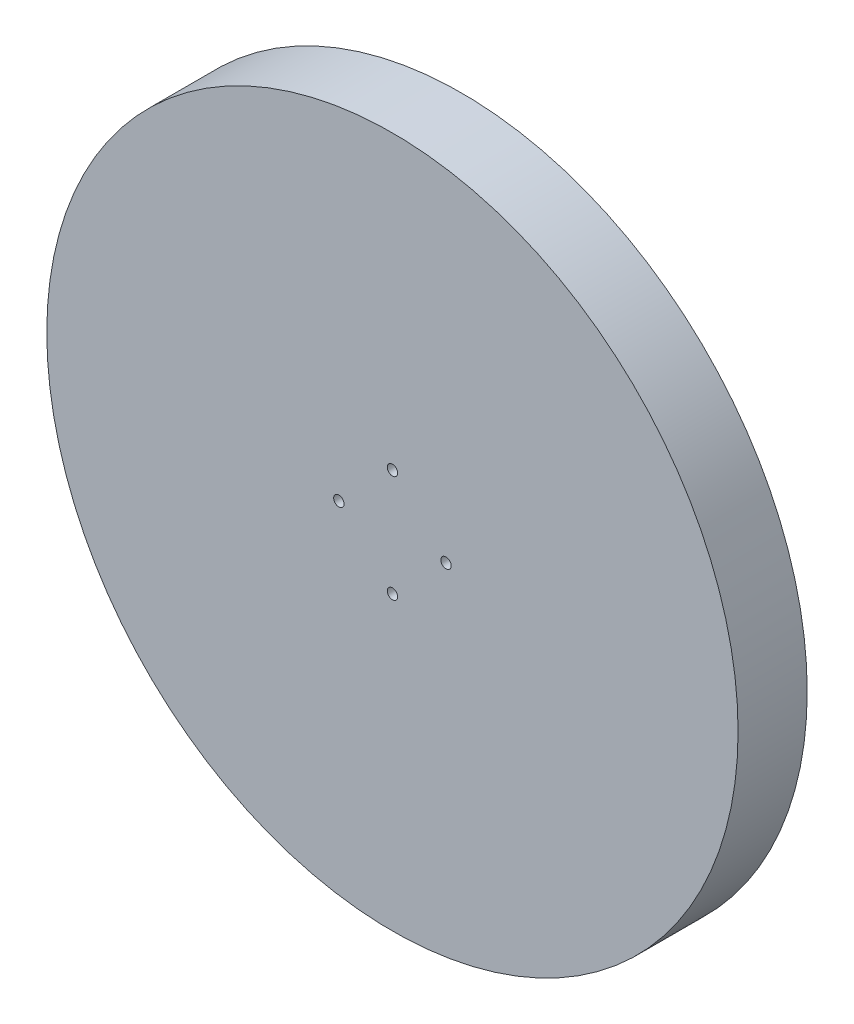
ISO-10303-21;
HEADER;
FILE_DESCRIPTION(('STEP AP214'),'2;1');
FILE_NAME('part.step','',(''),(''),'','','');
FILE_SCHEMA(('AUTOMOTIVE_DESIGN { 1 0 10303 214 1 1 1 1 }'));
ENDSEC;
DATA;
#1=APPLICATION_CONTEXT('core data for automotive mechanical design processes');
#2=APPLICATION_PROTOCOL_DEFINITION('international standard','automotive_design',2000,#1);
#3=PRODUCT_CONTEXT('',#1,'mechanical');
#4=PRODUCT('Part','Part','',(#3));
#5=PRODUCT_RELATED_PRODUCT_CATEGORY('part','',(#4));
#6=PRODUCT_DEFINITION_FORMATION('','',#4);
#7=PRODUCT_DEFINITION_CONTEXT('part definition',#1,'design');
#8=PRODUCT_DEFINITION('design','',#6,#7);
#9=PRODUCT_DEFINITION_SHAPE('','',#8);
#10=(LENGTH_UNIT() NAMED_UNIT(*) SI_UNIT(.MILLI.,.METRE.));
#11=(NAMED_UNIT(*) PLANE_ANGLE_UNIT() SI_UNIT($,.RADIAN.));
#12=(NAMED_UNIT(*) SI_UNIT($,.STERADIAN.) SOLID_ANGLE_UNIT());
#13=UNCERTAINTY_MEASURE_WITH_UNIT(LENGTH_MEASURE(1.E-05),#10,'distance_accuracy_value','');
#14=(GEOMETRIC_REPRESENTATION_CONTEXT(3) GLOBAL_UNCERTAINTY_ASSIGNED_CONTEXT((#13)) GLOBAL_UNIT_ASSIGNED_CONTEXT((#10,
#11,#12)) REPRESENTATION_CONTEXT('',''));
#15=CARTESIAN_POINT('',(0.,0.,0.));
#16=DIRECTION('',(0.,0.,1.));
#17=DIRECTION('',(1.,0.,0.));
#18=AXIS2_PLACEMENT_3D('',#15,#16,#17);
#19=CARTESIAN_POINT('',(0.,0.,20.));
#20=DIRECTION('',(0.,0.,-1.));
#21=DIRECTION('',(-1.,0.,0.));
#22=AXIS2_PLACEMENT_3D('',#19,#20,#21);
#23=CYLINDRICAL_SURFACE('',#22,100.);
#24=CARTESIAN_POINT('',(0.,0.,20.));
#25=DIRECTION('',(0.,0.,1.));
#26=DIRECTION('',(1.,0.,0.));
#27=AXIS2_PLACEMENT_3D('',#24,#25,#26);
#28=CIRCLE('',#27,100.);
#29=CARTESIAN_POINT('',(100.,0.,20.));
#30=VERTEX_POINT('',#29);
#31=EDGE_CURVE('E10',#30,#30,#28,.T.);
#32=ORIENTED_EDGE('',*,*,#31,.F.);
#33=EDGE_LOOP('',(#32));
#34=FACE_BOUND('',#33,.T.);
#35=CARTESIAN_POINT('',(0.,0.,0.));
#36=DIRECTION('',(0.,0.,1.));
#37=DIRECTION('',(1.,0.,0.));
#38=AXIS2_PLACEMENT_3D('',#35,#36,#37);
#39=CIRCLE('',#38,100.);
#40=CARTESIAN_POINT('',(100.,0.,0.));
#41=VERTEX_POINT('',#40);
#42=EDGE_CURVE('E44',#41,#41,#39,.T.);
#43=ORIENTED_EDGE('',*,*,#42,.T.);
#44=EDGE_LOOP('',(#43));
#45=FACE_BOUND('',#44,.T.);
#46=ADVANCED_FACE('F41',(#34,#45),#23,.T.);
#47=CARTESIAN_POINT('',(0.,0.,20.));
#48=DIRECTION('',(0.,0.,1.));
#49=DIRECTION('',(1.,0.,0.));
#50=AXIS2_PLACEMENT_3D('',#47,#48,#49);
#51=PLANE('',#50);
#52=CARTESIAN_POINT('',(0.,15.5,20.));
#53=DIRECTION('',(0.,0.,1.));
#54=DIRECTION('',(1.,0.,0.));
#55=AXIS2_PLACEMENT_3D('',#52,#53,#54);
#56=CIRCLE('',#55,1.5);
#57=CARTESIAN_POINT('',(1.5,15.5,20.));
#58=VERTEX_POINT('',#57);
#59=EDGE_CURVE('E79',#58,#58,#56,.T.);
#60=ORIENTED_EDGE('',*,*,#59,.F.);
#61=EDGE_LOOP('',(#60));
#62=FACE_BOUND('',#61,.T.);
#63=CARTESIAN_POINT('',(-15.5,0.,20.));
#64=DIRECTION('',(0.,0.,1.));
#65=DIRECTION('',(1.,0.,0.));
#66=AXIS2_PLACEMENT_3D('',#63,#64,#65);
#67=CIRCLE('',#66,1.5);
#68=CARTESIAN_POINT('',(-14.,0.,20.));
#69=VERTEX_POINT('',#68);
#70=EDGE_CURVE('E75',#69,#69,#67,.T.);
#71=ORIENTED_EDGE('',*,*,#70,.F.);
#72=EDGE_LOOP('',(#71));
#73=FACE_BOUND('',#72,.T.);
#74=CARTESIAN_POINT('',(15.5,0.,20.));
#75=DIRECTION('',(0.,0.,1.));
#76=DIRECTION('',(1.,0.,0.));
#77=AXIS2_PLACEMENT_3D('',#74,#75,#76);
#78=CIRCLE('',#77,1.5);
#79=CARTESIAN_POINT('',(17.,0.,20.));
#80=VERTEX_POINT('',#79);
#81=EDGE_CURVE('E67',#80,#80,#78,.T.);
#82=ORIENTED_EDGE('',*,*,#81,.F.);
#83=EDGE_LOOP('',(#82));
#84=FACE_BOUND('',#83,.T.);
#85=CARTESIAN_POINT('',(0.,-15.5,20.));
#86=DIRECTION('',(0.,0.,1.));
#87=DIRECTION('',(1.,0.,0.));
#88=AXIS2_PLACEMENT_3D('',#85,#86,#87);
#89=CIRCLE('',#88,1.5);
#90=CARTESIAN_POINT('',(1.5,-15.5,20.));
#91=VERTEX_POINT('',#90);
#92=EDGE_CURVE('E59',#91,#91,#89,.T.);
#93=ORIENTED_EDGE('',*,*,#92,.F.);
#94=EDGE_LOOP('',(#93));
#95=FACE_BOUND('',#94,.T.);
#96=ORIENTED_EDGE('',*,*,#31,.T.);
#97=EDGE_LOOP('',(#96));
#98=FACE_BOUND('',#97,.T.);
#99=ADVANCED_FACE('F97',(#62,#73,#84,#95,#98),#51,.T.);
#100=CARTESIAN_POINT('',(0.,0.,0.));
#101=DIRECTION('',(0.,0.,1.));
#102=DIRECTION('',(1.,0.,0.));
#103=AXIS2_PLACEMENT_3D('',#100,#101,#102);
#104=PLANE('',#103);
#105=CARTESIAN_POINT('',(0.,15.5,0.));
#106=DIRECTION('',(0.,0.,1.));
#107=DIRECTION('',(1.,0.,0.));
#108=AXIS2_PLACEMENT_3D('',#105,#106,#107);
#109=CIRCLE('',#108,1.5);
#110=CARTESIAN_POINT('',(1.5,15.5,0.));
#111=VERTEX_POINT('',#110);
#112=EDGE_CURVE('E53',#111,#111,#109,.T.);
#113=ORIENTED_EDGE('',*,*,#112,.T.);
#114=EDGE_LOOP('',(#113));
#115=FACE_BOUND('',#114,.T.);
#116=CARTESIAN_POINT('',(-15.5,0.,0.));
#117=DIRECTION('',(0.,0.,1.));
#118=DIRECTION('',(1.,0.,0.));
#119=AXIS2_PLACEMENT_3D('',#116,#117,#118);
#120=CIRCLE('',#119,1.5);
#121=CARTESIAN_POINT('',(-14.,0.,0.));
#122=VERTEX_POINT('',#121);
#123=EDGE_CURVE('E71',#122,#122,#120,.T.);
#124=ORIENTED_EDGE('',*,*,#123,.T.);
#125=EDGE_LOOP('',(#124));
#126=FACE_BOUND('',#125,.T.);
#127=CARTESIAN_POINT('',(15.5,0.,0.));
#128=DIRECTION('',(0.,0.,1.));
#129=DIRECTION('',(1.,0.,0.));
#130=AXIS2_PLACEMENT_3D('',#127,#128,#129);
#131=CIRCLE('',#130,1.5);
#132=CARTESIAN_POINT('',(17.,0.,0.));
#133=VERTEX_POINT('',#132);
#134=EDGE_CURVE('E63',#133,#133,#131,.T.);
#135=ORIENTED_EDGE('',*,*,#134,.T.);
#136=EDGE_LOOP('',(#135));
#137=FACE_BOUND('',#136,.T.);
#138=CARTESIAN_POINT('',(0.,-15.5,0.));
#139=DIRECTION('',(0.,0.,1.));
#140=DIRECTION('',(1.,0.,0.));
#141=AXIS2_PLACEMENT_3D('',#138,#139,#140);
#142=CIRCLE('',#141,1.5);
#143=CARTESIAN_POINT('',(1.5,-15.5,0.));
#144=VERTEX_POINT('',#143);
#145=EDGE_CURVE('E55',#144,#144,#142,.T.);
#146=ORIENTED_EDGE('',*,*,#145,.T.);
#147=EDGE_LOOP('',(#146));
#148=FACE_BOUND('',#147,.T.);
#149=ORIENTED_EDGE('',*,*,#42,.F.);
#150=EDGE_LOOP('',(#149));
#151=FACE_BOUND('',#150,.T.);
#152=ADVANCED_FACE('F87',(#115,#126,#137,#148,#151),#104,.F.);
#153=CARTESIAN_POINT('',(0.,-15.5,0.));
#154=DIRECTION('',(0.,0.,1.));
#155=DIRECTION('',(1.,0.,0.));
#156=AXIS2_PLACEMENT_3D('',#153,#154,#155);
#157=CYLINDRICAL_SURFACE('',#156,1.5);
#158=ORIENTED_EDGE('',*,*,#145,.F.);
#159=EDGE_LOOP('',(#158));
#160=FACE_BOUND('',#159,.T.);
#161=ORIENTED_EDGE('',*,*,#92,.T.);
#162=EDGE_LOOP('',(#161));
#163=FACE_BOUND('',#162,.T.);
#164=ADVANCED_FACE('F107',(#160,#163),#157,.F.);
#165=CARTESIAN_POINT('',(15.5,0.,0.));
#166=DIRECTION('',(0.,0.,1.));
#167=DIRECTION('',(1.,0.,0.));
#168=AXIS2_PLACEMENT_3D('',#165,#166,#167);
#169=CYLINDRICAL_SURFACE('',#168,1.5);
#170=ORIENTED_EDGE('',*,*,#134,.F.);
#171=EDGE_LOOP('',(#170));
#172=FACE_BOUND('',#171,.T.);
#173=ORIENTED_EDGE('',*,*,#81,.T.);
#174=EDGE_LOOP('',(#173));
#175=FACE_BOUND('',#174,.T.);
#176=ADVANCED_FACE('F109',(#172,#175),#169,.F.);
#177=CARTESIAN_POINT('',(-15.5,0.,0.));
#178=DIRECTION('',(0.,0.,1.));
#179=DIRECTION('',(1.,0.,0.));
#180=AXIS2_PLACEMENT_3D('',#177,#178,#179);
#181=CYLINDRICAL_SURFACE('',#180,1.5);
#182=ORIENTED_EDGE('',*,*,#123,.F.);
#183=EDGE_LOOP('',(#182));
#184=FACE_BOUND('',#183,.T.);
#185=ORIENTED_EDGE('',*,*,#70,.T.);
#186=EDGE_LOOP('',(#185));
#187=FACE_BOUND('',#186,.T.);
#188=ADVANCED_FACE('F93',(#184,#187),#181,.F.);
#189=CARTESIAN_POINT('',(0.,15.5,0.));
#190=DIRECTION('',(0.,0.,1.));
#191=DIRECTION('',(1.,0.,0.));
#192=AXIS2_PLACEMENT_3D('',#189,#190,#191);
#193=CYLINDRICAL_SURFACE('',#192,1.5);
#194=ORIENTED_EDGE('',*,*,#112,.F.);
#195=EDGE_LOOP('',(#194));
#196=FACE_BOUND('',#195,.T.);
#197=ORIENTED_EDGE('',*,*,#59,.T.);
#198=EDGE_LOOP('',(#197));
#199=FACE_BOUND('',#198,.T.);
#200=ADVANCED_FACE('F90',(#196,#199),#193,.F.);
#201=CLOSED_SHELL('',(#46,#99,#152,#164,#176,#188,#200));
#202=MANIFOLD_SOLID_BREP('B2',#201);
#203=ADVANCED_BREP_SHAPE_REPRESENTATION('',(#18,#202),#14);
#204=SHAPE_DEFINITION_REPRESENTATION(#9,#203);
ENDSEC;
END-ISO-10303-21;
